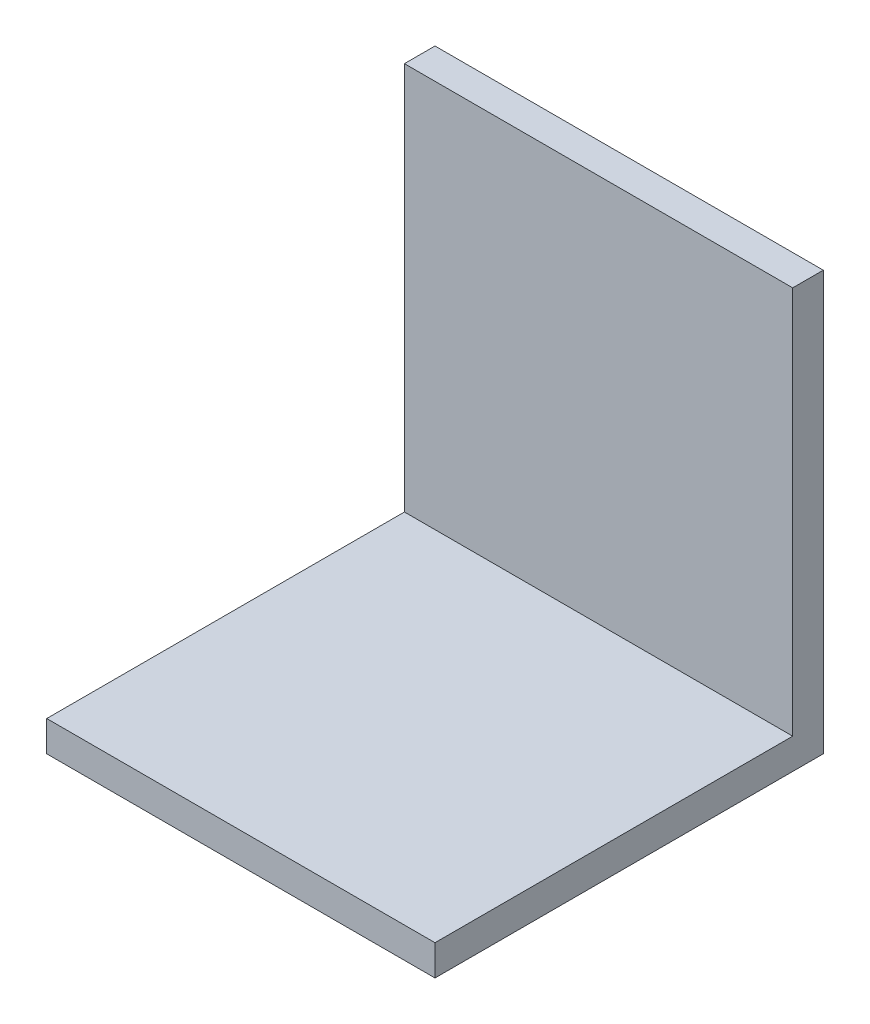
ISO-10303-21;
HEADER;
FILE_DESCRIPTION(('STEP AP214'),'2;1');
FILE_NAME('part.step','',(''),(''),'','','');
FILE_SCHEMA(('AUTOMOTIVE_DESIGN { 1 0 10303 214 1 1 1 1 }'));
ENDSEC;
DATA;
#1=APPLICATION_CONTEXT('core data for automotive mechanical design processes');
#2=APPLICATION_PROTOCOL_DEFINITION('international standard','automotive_design',2000,#1);
#3=PRODUCT_CONTEXT('',#1,'mechanical');
#4=PRODUCT('Part','Part','',(#3));
#5=PRODUCT_RELATED_PRODUCT_CATEGORY('part','',(#4));
#6=PRODUCT_DEFINITION_FORMATION('','',#4);
#7=PRODUCT_DEFINITION_CONTEXT('part definition',#1,'design');
#8=PRODUCT_DEFINITION('design','',#6,#7);
#9=PRODUCT_DEFINITION_SHAPE('','',#8);
#10=(LENGTH_UNIT() NAMED_UNIT(*) SI_UNIT(.MILLI.,.METRE.));
#11=(NAMED_UNIT(*) PLANE_ANGLE_UNIT() SI_UNIT($,.RADIAN.));
#12=(NAMED_UNIT(*) SI_UNIT($,.STERADIAN.) SOLID_ANGLE_UNIT());
#13=UNCERTAINTY_MEASURE_WITH_UNIT(LENGTH_MEASURE(1.E-05),#10,'distance_accuracy_value','');
#14=(GEOMETRIC_REPRESENTATION_CONTEXT(3) GLOBAL_UNCERTAINTY_ASSIGNED_CONTEXT((#13)) GLOBAL_UNIT_ASSIGNED_CONTEXT((#10,
#11,#12)) REPRESENTATION_CONTEXT('',''));
#15=CARTESIAN_POINT('',(0.,0.,0.));
#16=DIRECTION('',(0.,0.,1.));
#17=DIRECTION('',(1.,0.,0.));
#18=AXIS2_PLACEMENT_3D('',#15,#16,#17);
#19=CARTESIAN_POINT('',(-25.9474103174603,2.,-10.0147899470899));
#20=DIRECTION('',(1.,0.,0.));
#21=DIRECTION('',(0.,0.,-1.));
#22=AXIS2_PLACEMENT_3D('',#19,#20,#21);
#23=PLANE('',#22);
#24=DIRECTION('',(0.,0.,1.));
#25=VECTOR('',#24,1.);
#26=CARTESIAN_POINT('',(-25.9474103174603,0.,-10.0147899470899));
#27=LINE('',#26,#25);
#28=CARTESIAN_POINT('',(-25.9474103174603,0.,-10.0147899470899));
#29=VERTEX_POINT('',#28);
#30=CARTESIAN_POINT('',(-25.9474103174603,0.,15.3852100529101));
#31=VERTEX_POINT('',#30);
#32=EDGE_CURVE('E78',#29,#31,#27,.T.);
#33=ORIENTED_EDGE('',*,*,#32,.T.);
#34=DIRECTION('',(0.,-1.,0.));
#35=VECTOR('',#34,1.);
#36=CARTESIAN_POINT('',(-25.9474103174603,2.,15.3852100529101));
#37=LINE('',#36,#35);
#38=CARTESIAN_POINT('',(-25.9474103174603,2.,15.3852100529101));
#39=VERTEX_POINT('',#38);
#40=EDGE_CURVE('E11',#39,#31,#37,.T.);
#41=ORIENTED_EDGE('',*,*,#40,.F.);
#42=DIRECTION('',(0.,0.,1.));
#43=VECTOR('',#42,1.);
#44=CARTESIAN_POINT('',(-25.9474103174603,2.,-10.0147899470899));
#45=LINE('',#44,#43);
#46=CARTESIAN_POINT('',(-25.9474103174603,2.,-8.01478994708993));
#47=VERTEX_POINT('',#46);
#48=EDGE_CURVE('E99',#47,#39,#45,.T.);
#49=ORIENTED_EDGE('',*,*,#48,.F.);
#50=DIRECTION('',(0.,-1.,0.));
#51=VECTOR('',#50,1.);
#52=CARTESIAN_POINT('',(-25.9474103174603,27.4,-8.01478994708993));
#53=LINE('',#52,#51);
#54=CARTESIAN_POINT('',(-25.9474103174603,27.4,-8.01478994708993));
#55=VERTEX_POINT('',#54);
#56=EDGE_CURVE('E94',#55,#47,#53,.T.);
#57=ORIENTED_EDGE('',*,*,#56,.F.);
#58=DIRECTION('',(0.,0.,1.));
#59=VECTOR('',#58,1.);
#60=CARTESIAN_POINT('',(-25.9474103174603,27.4,-10.0147899470899));
#61=LINE('',#60,#59);
#62=CARTESIAN_POINT('',(-25.9474103174603,27.4,-10.0147899470899));
#63=VERTEX_POINT('',#62);
#64=EDGE_CURVE('E81',#63,#55,#61,.T.);
#65=ORIENTED_EDGE('',*,*,#64,.F.);
#66=DIRECTION('',(0.,-1.,0.));
#67=VECTOR('',#66,1.);
#68=CARTESIAN_POINT('',(-25.9474103174603,2.,-10.0147899470899));
#69=LINE('',#68,#67);
#70=EDGE_CURVE('E75',#63,#29,#69,.T.);
#71=ORIENTED_EDGE('',*,*,#70,.T.);
#72=EDGE_LOOP('',(#33,#41,#49,#57,#65,#71));
#73=FACE_BOUND('',#72,.T.);
#74=ADVANCED_FACE('F33',(#73),#23,.F.);
#75=CARTESIAN_POINT('',(-25.9474103174603,2.,15.3852100529101));
#76=DIRECTION('',(0.,0.,-1.));
#77=DIRECTION('',(-1.,0.,0.));
#78=AXIS2_PLACEMENT_3D('',#75,#76,#77);
#79=PLANE('',#78);
#80=DIRECTION('',(1.,0.,0.));
#81=VECTOR('',#80,1.);
#82=CARTESIAN_POINT('',(-25.9474103174603,0.,15.3852100529101));
#83=LINE('',#82,#81);
#84=CARTESIAN_POINT('',(-0.547410317460341,0.,15.3852100529101));
#85=VERTEX_POINT('',#84);
#86=EDGE_CURVE('E93',#31,#85,#83,.T.);
#87=ORIENTED_EDGE('',*,*,#86,.T.);
#88=DIRECTION('',(0.,-1.,0.));
#89=VECTOR('',#88,1.);
#90=CARTESIAN_POINT('',(-0.547410317460341,2.,15.3852100529101));
#91=LINE('',#90,#89);
#92=CARTESIAN_POINT('',(-0.547410317460341,2.,15.3852100529101));
#93=VERTEX_POINT('',#92);
#94=EDGE_CURVE('E40',#93,#85,#91,.T.);
#95=ORIENTED_EDGE('',*,*,#94,.F.);
#96=DIRECTION('',(1.,0.,0.));
#97=VECTOR('',#96,1.);
#98=CARTESIAN_POINT('',(-25.9474103174603,2.,15.3852100529101));
#99=LINE('',#98,#97);
#100=EDGE_CURVE('E102',#39,#93,#99,.T.);
#101=ORIENTED_EDGE('',*,*,#100,.F.);
#102=ORIENTED_EDGE('',*,*,#40,.T.);
#103=EDGE_LOOP('',(#87,#95,#101,#102));
#104=FACE_BOUND('',#103,.T.);
#105=ADVANCED_FACE('F111',(#104),#79,.F.);
#106=CARTESIAN_POINT('',(-0.547410317460341,2.,-10.0147899470899));
#107=DIRECTION('',(1.,0.,0.));
#108=DIRECTION('',(0.,0.,-1.));
#109=AXIS2_PLACEMENT_3D('',#106,#107,#108);
#110=PLANE('',#109);
#111=DIRECTION('',(0.,0.,1.));
#112=VECTOR('',#111,1.);
#113=CARTESIAN_POINT('',(-0.547410317460341,0.,-10.0147899470899));
#114=LINE('',#113,#112);
#115=CARTESIAN_POINT('',(-0.547410317460341,0.,-10.0147899470899));
#116=VERTEX_POINT('',#115);
#117=EDGE_CURVE('E100',#116,#85,#114,.T.);
#118=ORIENTED_EDGE('',*,*,#117,.F.);
#119=DIRECTION('',(0.,-1.,0.));
#120=VECTOR('',#119,1.);
#121=CARTESIAN_POINT('',(-0.547410317460341,2.,-10.0147899470899));
#122=LINE('',#121,#120);
#123=CARTESIAN_POINT('',(-0.547410317460341,27.4,-10.0147899470899));
#124=VERTEX_POINT('',#123);
#125=EDGE_CURVE('E86',#124,#116,#122,.T.);
#126=ORIENTED_EDGE('',*,*,#125,.F.);
#127=DIRECTION('',(0.,0.,1.));
#128=VECTOR('',#127,1.);
#129=CARTESIAN_POINT('',(-0.547410317460341,27.4,-10.0147899470899));
#130=LINE('',#129,#128);
#131=CARTESIAN_POINT('',(-0.547410317460341,27.4,-8.01478994708993));
#132=VERTEX_POINT('',#131);
#133=EDGE_CURVE('E122',#124,#132,#130,.T.);
#134=ORIENTED_EDGE('',*,*,#133,.T.);
#135=DIRECTION('',(0.,-1.,0.));
#136=VECTOR('',#135,1.);
#137=CARTESIAN_POINT('',(-0.547410317460341,27.4,-8.01478994708993));
#138=LINE('',#137,#136);
#139=CARTESIAN_POINT('',(-0.547410317460341,2.,-8.01478994708993));
#140=VERTEX_POINT('',#139);
#141=EDGE_CURVE('E117',#132,#140,#138,.T.);
#142=ORIENTED_EDGE('',*,*,#141,.T.);
#143=DIRECTION('',(0.,0.,1.));
#144=VECTOR('',#143,1.);
#145=CARTESIAN_POINT('',(-0.547410317460341,2.,-10.0147899470899));
#146=LINE('',#145,#144);
#147=EDGE_CURVE('E55',#140,#93,#146,.T.);
#148=ORIENTED_EDGE('',*,*,#147,.T.);
#149=ORIENTED_EDGE('',*,*,#94,.T.);
#150=EDGE_LOOP('',(#118,#126,#134,#142,#148,#149));
#151=FACE_BOUND('',#150,.T.);
#152=ADVANCED_FACE('F108',(#151),#110,.T.);
#153=CARTESIAN_POINT('',(-25.9474103174603,2.,-10.0147899470899));
#154=DIRECTION('',(0.,0.,-1.));
#155=DIRECTION('',(-1.,0.,0.));
#156=AXIS2_PLACEMENT_3D('',#153,#154,#155);
#157=PLANE('',#156);
#158=ORIENTED_EDGE('',*,*,#70,.F.);
#159=DIRECTION('',(1.,0.,0.));
#160=VECTOR('',#159,1.);
#161=CARTESIAN_POINT('',(-25.9474103174603,27.4,-10.0147899470899));
#162=LINE('',#161,#160);
#163=EDGE_CURVE('E119',#63,#124,#162,.T.);
#164=ORIENTED_EDGE('',*,*,#163,.T.);
#165=ORIENTED_EDGE('',*,*,#125,.T.);
#166=DIRECTION('',(1.,0.,0.));
#167=VECTOR('',#166,1.);
#168=CARTESIAN_POINT('',(-25.9474103174603,0.,-10.0147899470899));
#169=LINE('',#168,#167);
#170=EDGE_CURVE('E91',#29,#116,#169,.T.);
#171=ORIENTED_EDGE('',*,*,#170,.F.);
#172=EDGE_LOOP('',(#158,#164,#165,#171));
#173=FACE_BOUND('',#172,.T.);
#174=ADVANCED_FACE('F96',(#173),#157,.T.);
#175=CARTESIAN_POINT('',(0.,2.,0.));
#176=DIRECTION('',(0.,1.,0.));
#177=DIRECTION('',(0.,0.,1.));
#178=AXIS2_PLACEMENT_3D('',#175,#176,#177);
#179=PLANE('',#178);
#180=DIRECTION('',(1.,0.,0.));
#181=VECTOR('',#180,1.);
#182=CARTESIAN_POINT('',(-25.9474103174603,2.,-8.01478994708993));
#183=LINE('',#182,#181);
#184=EDGE_CURVE('E47',#47,#140,#183,.T.);
#185=ORIENTED_EDGE('',*,*,#184,.F.);
#186=ORIENTED_EDGE('',*,*,#48,.T.);
#187=ORIENTED_EDGE('',*,*,#100,.T.);
#188=ORIENTED_EDGE('',*,*,#147,.F.);
#189=EDGE_LOOP('',(#185,#186,#187,#188));
#190=FACE_BOUND('',#189,.T.);
#191=ADVANCED_FACE('F143',(#190),#179,.T.);
#192=CARTESIAN_POINT('',(0.,0.,0.));
#193=DIRECTION('',(0.,1.,0.));
#194=DIRECTION('',(0.,0.,1.));
#195=AXIS2_PLACEMENT_3D('',#192,#193,#194);
#196=PLANE('',#195);
#197=ORIENTED_EDGE('',*,*,#170,.T.);
#198=ORIENTED_EDGE('',*,*,#117,.T.);
#199=ORIENTED_EDGE('',*,*,#86,.F.);
#200=ORIENTED_EDGE('',*,*,#32,.F.);
#201=EDGE_LOOP('',(#197,#198,#199,#200));
#202=FACE_BOUND('',#201,.T.);
#203=ADVANCED_FACE('F89',(#202),#196,.F.);
#204=CARTESIAN_POINT('',(-25.9474103174603,27.4,-8.01478994708993));
#205=DIRECTION('',(0.,0.,-1.));
#206=DIRECTION('',(-1.,0.,0.));
#207=AXIS2_PLACEMENT_3D('',#204,#205,#206);
#208=PLANE('',#207);
#209=ORIENTED_EDGE('',*,*,#184,.T.);
#210=ORIENTED_EDGE('',*,*,#141,.F.);
#211=DIRECTION('',(1.,0.,0.));
#212=VECTOR('',#211,1.);
#213=CARTESIAN_POINT('',(-25.9474103174603,27.4,-8.01478994708993));
#214=LINE('',#213,#212);
#215=EDGE_CURVE('E125',#55,#132,#214,.T.);
#216=ORIENTED_EDGE('',*,*,#215,.F.);
#217=ORIENTED_EDGE('',*,*,#56,.T.);
#218=EDGE_LOOP('',(#209,#210,#216,#217));
#219=FACE_BOUND('',#218,.T.);
#220=ADVANCED_FACE('F138',(#219),#208,.F.);
#221=CARTESIAN_POINT('',(0.,27.4,0.));
#222=DIRECTION('',(0.,1.,0.));
#223=DIRECTION('',(0.,0.,1.));
#224=AXIS2_PLACEMENT_3D('',#221,#222,#223);
#225=PLANE('',#224);
#226=ORIENTED_EDGE('',*,*,#64,.T.);
#227=ORIENTED_EDGE('',*,*,#215,.T.);
#228=ORIENTED_EDGE('',*,*,#133,.F.);
#229=ORIENTED_EDGE('',*,*,#163,.F.);
#230=EDGE_LOOP('',(#226,#227,#228,#229));
#231=FACE_BOUND('',#230,.T.);
#232=ADVANCED_FACE('F130',(#231),#225,.T.);
#233=CLOSED_SHELL('',(#74,#105,#152,#174,#191,#203,#220,#232));
#234=MANIFOLD_SOLID_BREP('B2',#233);
#235=ADVANCED_BREP_SHAPE_REPRESENTATION('',(#18,#234),#14);
#236=SHAPE_DEFINITION_REPRESENTATION(#9,#235);
ENDSEC;
END-ISO-10303-21;
